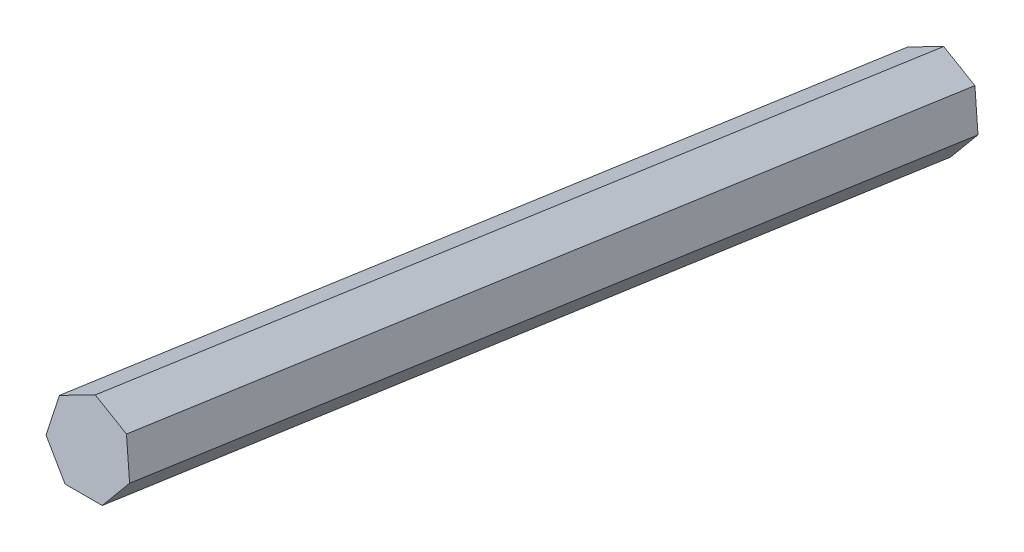
ISO-10303-21;
HEADER;
FILE_DESCRIPTION(('STEP AP214'),'2;1');
FILE_NAME('part.step','',(''),(''),'','','');
FILE_SCHEMA(('AUTOMOTIVE_DESIGN { 1 0 10303 214 1 1 1 1 }'));
ENDSEC;
DATA;
#1=APPLICATION_CONTEXT('core data for automotive mechanical design processes');
#2=APPLICATION_PROTOCOL_DEFINITION('international standard','automotive_design',2000,#1);
#3=PRODUCT_CONTEXT('',#1,'mechanical');
#4=PRODUCT('Part','Part','',(#3));
#5=PRODUCT_RELATED_PRODUCT_CATEGORY('part','',(#4));
#6=PRODUCT_DEFINITION_FORMATION('','',#4);
#7=PRODUCT_DEFINITION_CONTEXT('part definition',#1,'design');
#8=PRODUCT_DEFINITION('design','',#6,#7);
#9=PRODUCT_DEFINITION_SHAPE('','',#8);
#10=(LENGTH_UNIT() NAMED_UNIT(*) SI_UNIT(.MILLI.,.METRE.));
#11=(NAMED_UNIT(*) PLANE_ANGLE_UNIT() SI_UNIT($,.RADIAN.));
#12=(NAMED_UNIT(*) SI_UNIT($,.STERADIAN.) SOLID_ANGLE_UNIT());
#13=UNCERTAINTY_MEASURE_WITH_UNIT(LENGTH_MEASURE(1.E-05),#10,'distance_accuracy_value','');
#14=(GEOMETRIC_REPRESENTATION_CONTEXT(3) GLOBAL_UNCERTAINTY_ASSIGNED_CONTEXT((#13)) GLOBAL_UNIT_ASSIGNED_CONTEXT((#10,
#11,#12)) REPRESENTATION_CONTEXT('',''));
#15=CARTESIAN_POINT('',(0.,0.,0.));
#16=DIRECTION('',(0.,0.,1.));
#17=DIRECTION('',(1.,0.,0.));
#18=AXIS2_PLACEMENT_3D('',#15,#16,#17);
#19=CARTESIAN_POINT('',(2.50855749373998E-13,-9.79591836734677,-67.8681132761683));
#20=DIRECTION('',(0.,0.14285714285714,0.989743318610787));
#21=DIRECTION('',(0.,-0.989743318610788,0.14285714285714));
#22=AXIS2_PLACEMENT_3D('',#19,#20,#21);
#23=PLANE('',#22);
#24=DIRECTION('',(-0.90096886790242,0.429433531845466,-0.0619833913025101));
#25=VECTOR('',#24,1.);
#26=CARTESIAN_POINT('',(2.7364101886381,2.15983202964077,-69.5937772036845));
#27=LINE('',#26,#25);
#28=CARTESIAN_POINT('',(2.7364101886381,2.15983202964077,-69.5937772036845));
#29=VERTEX_POINT('',#28);
#30=CARTESIAN_POINT('',(0.,3.46410161513775,-69.7820323027551));
#31=VERTEX_POINT('',#30);
#32=EDGE_CURVE('E97',#29,#31,#27,.T.);
#33=ORIENTED_EDGE('',*,*,#32,.F.);
#34=DIRECTION('',(-0.222520933956318,0.964928387209124,-0.139275416025972));
#35=VECTOR('',#34,1.);
#36=CARTESIAN_POINT('',(3.41224769263638,-0.770835126720019,-69.1707718357769));
#37=LINE('',#36,#35);
#38=CARTESIAN_POINT('',(3.41224769263638,-0.770835126720019,-69.1707718357769));
#39=VERTEX_POINT('',#38);
#40=EDGE_CURVE('E67',#39,#29,#37,.T.);
#41=ORIENTED_EDGE('',*,*,#40,.F.);
#42=DIRECTION('',(0.623489801858731,0.773812486052301,-0.111690211781149));
#43=VECTOR('',#42,1.);
#44=CARTESIAN_POINT('',(1.51859308691146,-3.1210477104896,-68.8315478688039));
#45=LINE('',#44,#43);
#46=CARTESIAN_POINT('',(1.51859308691146,-3.1210477104896,-68.8315478688039));
#47=VERTEX_POINT('',#46);
#48=EDGE_CURVE('E73',#47,#39,#45,.T.);
#49=ORIENTED_EDGE('',*,*,#48,.F.);
#50=DIRECTION('',(1.,0.,0.));
#51=VECTOR('',#50,1.);
#52=CARTESIAN_POINT('',(-1.51859308691144,-3.12104771048961,-68.8315478688039));
#53=LINE('',#52,#51);
#54=CARTESIAN_POINT('',(-1.51859308691144,-3.12104771048961,-68.8315478688039));
#55=VERTEX_POINT('',#54);
#56=EDGE_CURVE('E78',#55,#47,#53,.T.);
#57=ORIENTED_EDGE('',*,*,#56,.F.);
#58=DIRECTION('',(0.623489801858736,-0.773812486052297,0.111690211781149));
#59=VECTOR('',#58,1.);
#60=CARTESIAN_POINT('',(-3.41224769263638,-0.77083512672004,-69.1707718357769));
#61=LINE('',#60,#59);
#62=CARTESIAN_POINT('',(-3.41224769263638,-0.77083512672004,-69.1707718357769));
#63=VERTEX_POINT('',#62);
#64=EDGE_CURVE('E129',#63,#55,#61,.T.);
#65=ORIENTED_EDGE('',*,*,#64,.F.);
#66=DIRECTION('',(-0.222520933956312,-0.964928387209125,0.139275416025972));
#67=VECTOR('',#66,1.);
#68=CARTESIAN_POINT('',(-2.73641018863811,2.15983202964075,-69.5937772036845));
#69=LINE('',#68,#67);
#70=CARTESIAN_POINT('',(-2.73641018863811,2.15983202964075,-69.5937772036845));
#71=VERTEX_POINT('',#70);
#72=EDGE_CURVE('E120',#71,#63,#69,.T.);
#73=ORIENTED_EDGE('',*,*,#72,.F.);
#74=DIRECTION('',(-0.900968867902418,-0.429433531845472,0.0619833913025101));
#75=VECTOR('',#74,1.);
#76=CARTESIAN_POINT('',(0.,3.46410161513775,-69.7820323027551));
#77=LINE('',#76,#75);
#78=EDGE_CURVE('E99',#31,#71,#77,.T.);
#79=ORIENTED_EDGE('',*,*,#78,.F.);
#80=EDGE_LOOP('',(#33,#41,#49,#57,#65,#73,#79));
#81=FACE_BOUND('',#80,.T.);
#82=ADVANCED_FACE('F36',(#81),#23,.F.);
#83=CARTESIAN_POINT('',(2.50855749373998E-13,0.20408163265323,1.41391902658682));
#84=DIRECTION('',(0.,0.14285714285714,0.989743318610787));
#85=DIRECTION('',(0.,-0.989743318610788,0.14285714285714));
#86=AXIS2_PLACEMENT_3D('',#83,#84,#85);
#87=PLANE('',#86);
#88=DIRECTION('',(-0.90096886790242,0.429433531845466,-0.0619833913025101));
#89=VECTOR('',#88,1.);
#90=CARTESIAN_POINT('',(2.7364101886381,12.1598320296408,-0.311744900929362));
#91=LINE('',#90,#89);
#92=CARTESIAN_POINT('',(2.7364101886381,12.1598320296408,-0.311744900929362));
#93=VERTEX_POINT('',#92);
#94=CARTESIAN_POINT('',(0.,13.4641016151378,-0.5));
#95=VERTEX_POINT('',#94);
#96=EDGE_CURVE('E113',#93,#95,#91,.T.);
#97=ORIENTED_EDGE('',*,*,#96,.T.);
#98=DIRECTION('',(-0.900968867902418,-0.429433531845472,0.0619833913025101));
#99=VECTOR('',#98,1.);
#100=CARTESIAN_POINT('',(0.,13.4641016151378,-0.5));
#101=LINE('',#100,#99);
#102=CARTESIAN_POINT('',(-2.73641018863811,12.1598320296408,-0.311744900929362));
#103=VERTEX_POINT('',#102);
#104=EDGE_CURVE('E121',#95,#103,#101,.T.);
#105=ORIENTED_EDGE('',*,*,#104,.T.);
#106=DIRECTION('',(-0.222520933956312,-0.964928387209125,0.139275416025972));
#107=VECTOR('',#106,1.);
#108=CARTESIAN_POINT('',(-2.73641018863811,12.1598320296407,-0.311744900929362));
#109=LINE('',#108,#107);
#110=CARTESIAN_POINT('',(-3.41224769263638,9.22916487327996,0.111260466978153));
#111=VERTEX_POINT('',#110);
#112=EDGE_CURVE('E126',#103,#111,#109,.T.);
#113=ORIENTED_EDGE('',*,*,#112,.T.);
#114=DIRECTION('',(0.623489801858736,-0.773812486052297,0.111690211781149));
#115=VECTOR('',#114,1.);
#116=CARTESIAN_POINT('',(-3.41224769263638,9.22916487327996,0.111260466978153));
#117=LINE('',#116,#115);
#118=CARTESIAN_POINT('',(-1.51859308691144,6.87895228951039,0.450484433951209));
#119=VERTEX_POINT('',#118);
#120=EDGE_CURVE('E134',#111,#119,#117,.T.);
#121=ORIENTED_EDGE('',*,*,#120,.T.);
#122=DIRECTION('',(1.,0.,0.));
#123=VECTOR('',#122,1.);
#124=CARTESIAN_POINT('',(-1.51859308691144,6.87895228951039,0.450484433951209));
#125=LINE('',#124,#123);
#126=CARTESIAN_POINT('',(1.51859308691146,6.8789522895104,0.450484433951209));
#127=VERTEX_POINT('',#126);
#128=EDGE_CURVE('E55',#119,#127,#125,.T.);
#129=ORIENTED_EDGE('',*,*,#128,.T.);
#130=DIRECTION('',(0.623489801858731,0.773812486052301,-0.111690211781149));
#131=VECTOR('',#130,1.);
#132=CARTESIAN_POINT('',(1.51859308691146,6.8789522895104,0.450484433951209));
#133=LINE('',#132,#131);
#134=CARTESIAN_POINT('',(3.41224769263638,9.22916487327998,0.111260466978153));
#135=VERTEX_POINT('',#134);
#136=EDGE_CURVE('E49',#127,#135,#133,.T.);
#137=ORIENTED_EDGE('',*,*,#136,.T.);
#138=DIRECTION('',(-0.222520933956318,0.964928387209124,-0.139275416025972));
#139=VECTOR('',#138,1.);
#140=CARTESIAN_POINT('',(3.41224769263638,9.22916487327998,0.111260466978153));
#141=LINE('',#140,#139);
#142=EDGE_CURVE('E11',#135,#93,#141,.T.);
#143=ORIENTED_EDGE('',*,*,#142,.T.);
#144=EDGE_LOOP('',(#97,#105,#113,#121,#129,#137,#143));
#145=FACE_BOUND('',#144,.T.);
#146=ADVANCED_FACE('F164',(#145),#87,.T.);
#147=CARTESIAN_POINT('',(2.7364101886381,2.15983202964077,-69.5937772036845));
#148=DIRECTION('',(0.433883739117556,0.891727917282745,-0.128709838271774));
#149=DIRECTION('',(-0.899207256472742,0.437522925007096,0.));
#150=AXIS2_PLACEMENT_3D('',#147,#148,#149);
#151=PLANE('',#150);
#152=DIRECTION('',(0.,0.142857142857143,0.989743318610787));
#153=VECTOR('',#152,1.);
#154=CARTESIAN_POINT('',(0.,3.46410161513775,-69.7820323027551));
#155=LINE('',#154,#153);
#156=EDGE_CURVE('E115',#31,#95,#155,.T.);
#157=ORIENTED_EDGE('',*,*,#156,.T.);
#158=ORIENTED_EDGE('',*,*,#96,.F.);
#159=DIRECTION('',(0.,0.142857142857143,0.989743318610787));
#160=VECTOR('',#159,1.);
#161=CARTESIAN_POINT('',(2.7364101886381,2.15983202964077,-69.5937772036845));
#162=LINE('',#161,#160);
#163=EDGE_CURVE('E109',#29,#93,#162,.T.);
#164=ORIENTED_EDGE('',*,*,#163,.F.);
#165=ORIENTED_EDGE('',*,*,#32,.T.);
#166=EDGE_LOOP('',(#157,#158,#164,#165));
#167=FACE_BOUND('',#166,.T.);
#168=ADVANCED_FACE('F112',(#167),#151,.T.);
#169=CARTESIAN_POINT('',(0.,3.46410161513775,-69.7820323027551));
#170=DIRECTION('',(-0.433883739117561,0.891727917282743,-0.128709838271774));
#171=DIRECTION('',(-0.899207256472739,-0.437522925007101,0.));
#172=AXIS2_PLACEMENT_3D('',#169,#170,#171);
#173=PLANE('',#172);
#174=DIRECTION('',(0.,0.142857142857143,0.989743318610787));
#175=VECTOR('',#174,1.);
#176=CARTESIAN_POINT('',(-2.73641018863811,2.15983202964075,-69.5937772036845));
#177=LINE('',#176,#175);
#178=EDGE_CURVE('E123',#71,#103,#177,.T.);
#179=ORIENTED_EDGE('',*,*,#178,.T.);
#180=ORIENTED_EDGE('',*,*,#104,.F.);
#181=ORIENTED_EDGE('',*,*,#156,.F.);
#182=ORIENTED_EDGE('',*,*,#78,.T.);
#183=EDGE_LOOP('',(#179,#180,#181,#182));
#184=FACE_BOUND('',#183,.T.);
#185=ADVANCED_FACE('F163',(#184),#173,.T.);
#186=CARTESIAN_POINT('',(-2.73641018863811,2.15983202964075,-69.5937772036845));
#187=DIRECTION('',(-0.974927912181824,0.220238607634291,-0.0317887048509016));
#188=DIRECTION('',(-0.220349969994242,-0.975420878761336,0.));
#189=AXIS2_PLACEMENT_3D('',#186,#187,#188);
#190=PLANE('',#189);
#191=DIRECTION('',(0.,0.142857142857143,0.989743318610787));
#192=VECTOR('',#191,1.);
#193=CARTESIAN_POINT('',(-3.41224769263638,-0.77083512672004,-69.1707718357769));
#194=LINE('',#193,#192);
#195=EDGE_CURVE('E131',#63,#111,#194,.T.);
#196=ORIENTED_EDGE('',*,*,#195,.T.);
#197=ORIENTED_EDGE('',*,*,#112,.F.);
#198=ORIENTED_EDGE('',*,*,#178,.F.);
#199=ORIENTED_EDGE('',*,*,#72,.T.);
#200=EDGE_LOOP('',(#196,#197,#198,#199));
#201=FACE_BOUND('',#200,.T.);
#202=ADVANCED_FACE('F159',(#201),#190,.T.);
#203=CARTESIAN_POINT('',(-3.41224769263638,-0.77083512672004,-69.1707718357769));
#204=DIRECTION('',(-0.781831482468028,-0.617094865611647,0.0890699716941051));
#205=DIRECTION('',(0.619557376181022,-0.784951372773936,0.));
#206=AXIS2_PLACEMENT_3D('',#203,#204,#205);
#207=PLANE('',#206);
#208=DIRECTION('',(0.,0.142857142857143,0.989743318610787));
#209=VECTOR('',#208,1.);
#210=CARTESIAN_POINT('',(-1.51859308691144,-3.12104771048961,-68.8315478688039));
#211=LINE('',#210,#209);
#212=EDGE_CURVE('E137',#55,#119,#211,.T.);
#213=ORIENTED_EDGE('',*,*,#212,.T.);
#214=ORIENTED_EDGE('',*,*,#120,.F.);
#215=ORIENTED_EDGE('',*,*,#195,.F.);
#216=ORIENTED_EDGE('',*,*,#64,.T.);
#217=EDGE_LOOP('',(#213,#214,#215,#216));
#218=FACE_BOUND('',#217,.T.);
#219=ADVANCED_FACE('F155',(#218),#207,.T.);
#220=CARTESIAN_POINT('',(-1.51859308691144,-3.12104771048961,-68.8315478688039));
#221=DIRECTION('',(0.,-0.989743318610787,0.142857142857143));
#222=DIRECTION('',(0.,-0.142857142857143,-0.989743318610787));
#223=AXIS2_PLACEMENT_3D('',#220,#221,#222);
#224=PLANE('',#223);
#225=DIRECTION('',(0.,0.142857142857143,0.989743318610787));
#226=VECTOR('',#225,1.);
#227=CARTESIAN_POINT('',(1.51859308691146,-3.1210477104896,-68.8315478688039));
#228=LINE('',#227,#226);
#229=EDGE_CURVE('E142',#47,#127,#228,.T.);
#230=ORIENTED_EDGE('',*,*,#229,.T.);
#231=ORIENTED_EDGE('',*,*,#128,.F.);
#232=ORIENTED_EDGE('',*,*,#212,.F.);
#233=ORIENTED_EDGE('',*,*,#56,.T.);
#234=EDGE_LOOP('',(#230,#231,#232,#233));
#235=FACE_BOUND('',#234,.T.);
#236=ADVANCED_FACE('F151',(#235),#224,.T.);
#237=CARTESIAN_POINT('',(1.51859308691146,-3.1210477104896,-68.8315478688039));
#238=DIRECTION('',(0.781831482468032,-0.617094865611642,0.0890699716941044));
#239=DIRECTION('',(0.619557376181017,0.78495137277394,0.));
#240=AXIS2_PLACEMENT_3D('',#237,#238,#239);
#241=PLANE('',#240);
#242=DIRECTION('',(0.,0.142857142857143,0.989743318610787));
#243=VECTOR('',#242,1.);
#244=CARTESIAN_POINT('',(3.41224769263638,-0.770835126720019,-69.1707718357769));
#245=LINE('',#244,#243);
#246=EDGE_CURVE('E43',#39,#135,#245,.T.);
#247=ORIENTED_EDGE('',*,*,#246,.T.);
#248=ORIENTED_EDGE('',*,*,#136,.F.);
#249=ORIENTED_EDGE('',*,*,#229,.F.);
#250=ORIENTED_EDGE('',*,*,#48,.T.);
#251=EDGE_LOOP('',(#247,#248,#249,#250));
#252=FACE_BOUND('',#251,.T.);
#253=ADVANCED_FACE('F148',(#252),#241,.T.);
#254=CARTESIAN_POINT('',(3.41224769263638,-0.770835126720019,-69.1707718357769));
#255=DIRECTION('',(0.974927912181823,0.220238607634298,-0.0317887048509025));
#256=DIRECTION('',(-0.220349969994248,0.975420878761334,0.));
#257=AXIS2_PLACEMENT_3D('',#254,#255,#256);
#258=PLANE('',#257);
#259=ORIENTED_EDGE('',*,*,#142,.F.);
#260=ORIENTED_EDGE('',*,*,#246,.F.);
#261=ORIENTED_EDGE('',*,*,#40,.T.);
#262=ORIENTED_EDGE('',*,*,#163,.T.);
#263=EDGE_LOOP('',(#259,#260,#261,#262));
#264=FACE_BOUND('',#263,.T.);
#265=ADVANCED_FACE('F108',(#264),#258,.T.);
#266=CLOSED_SHELL('',(#82,#146,#168,#185,#202,#219,#236,#253,#265));
#267=MANIFOLD_SOLID_BREP('B2',#266);
#268=ADVANCED_BREP_SHAPE_REPRESENTATION('',(#18,#267),#14);
#269=SHAPE_DEFINITION_REPRESENTATION(#9,#268);
ENDSEC;
END-ISO-10303-21;
